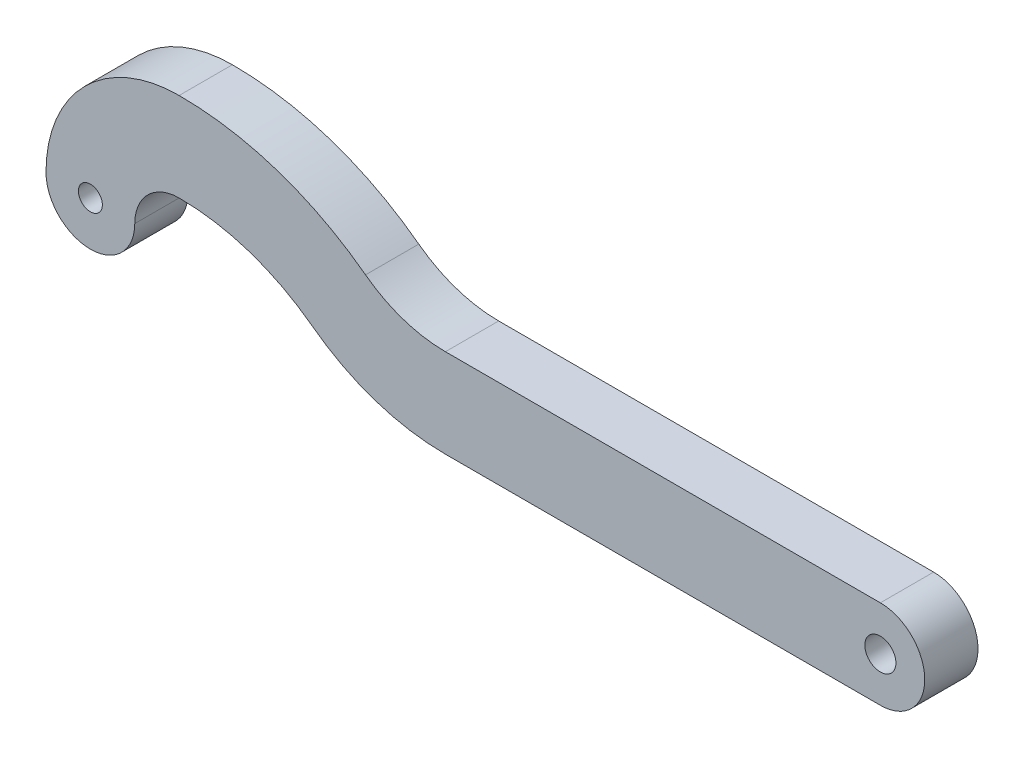
ISO-10303-21;
HEADER;
FILE_DESCRIPTION(('STEP AP214'),'2;1');
FILE_NAME('part.step','',(''),(''),'','','');
FILE_SCHEMA(('AUTOMOTIVE_DESIGN { 1 0 10303 214 1 1 1 1 }'));
ENDSEC;
DATA;
#1=APPLICATION_CONTEXT('core data for automotive mechanical design processes');
#2=APPLICATION_PROTOCOL_DEFINITION('international standard','automotive_design',2000,#1);
#3=PRODUCT_CONTEXT('',#1,'mechanical');
#4=PRODUCT('Part','Part','',(#3));
#5=PRODUCT_RELATED_PRODUCT_CATEGORY('part','',(#4));
#6=PRODUCT_DEFINITION_FORMATION('','',#4);
#7=PRODUCT_DEFINITION_CONTEXT('part definition',#1,'design');
#8=PRODUCT_DEFINITION('design','',#6,#7);
#9=PRODUCT_DEFINITION_SHAPE('','',#8);
#10=(LENGTH_UNIT() NAMED_UNIT(*) SI_UNIT(.MILLI.,.METRE.));
#11=(NAMED_UNIT(*) PLANE_ANGLE_UNIT() SI_UNIT($,.RADIAN.));
#12=(NAMED_UNIT(*) SI_UNIT($,.STERADIAN.) SOLID_ANGLE_UNIT());
#13=UNCERTAINTY_MEASURE_WITH_UNIT(LENGTH_MEASURE(1.E-05),#10,'distance_accuracy_value','');
#14=(GEOMETRIC_REPRESENTATION_CONTEXT(3) GLOBAL_UNCERTAINTY_ASSIGNED_CONTEXT((#13)) GLOBAL_UNIT_ASSIGNED_CONTEXT((#10,
#11,#12)) REPRESENTATION_CONTEXT('',''));
#15=CARTESIAN_POINT('',(0.,0.,0.));
#16=DIRECTION('',(0.,0.,1.));
#17=DIRECTION('',(1.,0.,0.));
#18=AXIS2_PLACEMENT_3D('',#15,#16,#17);
#19=CARTESIAN_POINT('',(0.,5.,6.));
#20=DIRECTION('',(0.,0.,1.));
#21=DIRECTION('',(1.,0.,0.));
#22=AXIS2_PLACEMENT_3D('',#19,#20,#21);
#23=PLANE('',#22);
#24=CARTESIAN_POINT('',(0.,5.,6.));
#25=DIRECTION('',(0.,0.,1.));
#26=DIRECTION('',(1.,0.,0.));
#27=AXIS2_PLACEMENT_3D('',#24,#25,#26);
#28=CIRCLE('',#27,1.35);
#29=CARTESIAN_POINT('',(1.35,5.,6.));
#30=VERTEX_POINT('',#29);
#31=EDGE_CURVE('E165',#30,#30,#28,.T.);
#32=ORIENTED_EDGE('',*,*,#31,.F.);
#33=EDGE_LOOP('',(#32));
#34=FACE_BOUND('',#33,.T.);
#35=CARTESIAN_POINT('',(0.,5.,6.));
#36=DIRECTION('',(0.,0.,1.));
#37=DIRECTION('',(1.,0.,0.));
#38=AXIS2_PLACEMENT_3D('',#35,#36,#37);
#39=CIRCLE('',#38,5.);
#40=CARTESIAN_POINT('',(-5.,5.,6.));
#41=VERTEX_POINT('',#40);
#42=CARTESIAN_POINT('',(5.,5.,6.));
#43=VERTEX_POINT('',#42);
#44=EDGE_CURVE('E60',#41,#43,#39,.T.);
#45=ORIENTED_EDGE('',*,*,#44,.T.);
#46=CARTESIAN_POINT('',(10.,5.,6.));
#47=DIRECTION('',(0.,0.,-1.));
#48=DIRECTION('',(-1.,0.,0.));
#49=AXIS2_PLACEMENT_3D('',#46,#47,#48);
#50=CIRCLE('',#49,5.);
#51=CARTESIAN_POINT('',(10.,10.,6.));
#52=VERTEX_POINT('',#51);
#53=EDGE_CURVE('E111',#43,#52,#50,.T.);
#54=ORIENTED_EDGE('',*,*,#53,.T.);
#55=CARTESIAN_POINT('',(10.,-15.,6.));
#56=DIRECTION('',(0.,0.,-1.));
#57=DIRECTION('',(-1.,0.,0.));
#58=AXIS2_PLACEMENT_3D('',#55,#56,#57);
#59=CIRCLE('',#58,25.);
#60=CARTESIAN_POINT('',(25.,5.,6.));
#61=VERTEX_POINT('',#60);
#62=EDGE_CURVE('E282',#52,#61,#59,.T.);
#63=ORIENTED_EDGE('',*,*,#62,.T.);
#64=CARTESIAN_POINT('',(40.,24.9999999999999,6.));
#65=DIRECTION('',(0.,0.,1.));
#66=DIRECTION('',(1.,0.,0.));
#67=AXIS2_PLACEMENT_3D('',#64,#65,#66);
#68=CIRCLE('',#67,24.9999999999999);
#69=CARTESIAN_POINT('',(40.,0.,6.));
#70=VERTEX_POINT('',#69);
#71=EDGE_CURVE('E295',#61,#70,#68,.T.);
#72=ORIENTED_EDGE('',*,*,#71,.T.);
#73=DIRECTION('',(1.,0.,0.));
#74=VECTOR('',#73,1.);
#75=CARTESIAN_POINT('',(40.,0.,6.));
#76=LINE('',#75,#74);
#77=CARTESIAN_POINT('',(89.,0.,6.));
#78=VERTEX_POINT('',#77);
#79=EDGE_CURVE('E291',#70,#78,#76,.T.);
#80=ORIENTED_EDGE('',*,*,#79,.T.);
#81=CARTESIAN_POINT('',(89.,5.,6.));
#82=DIRECTION('',(0.,0.,1.));
#83=DIRECTION('',(-1.,0.,0.));
#84=AXIS2_PLACEMENT_3D('',#81,#82,#83);
#85=CIRCLE('',#84,5.);
#86=CARTESIAN_POINT('',(89.,10.,6.));
#87=VERTEX_POINT('',#86);
#88=EDGE_CURVE('E294',#78,#87,#85,.T.);
#89=ORIENTED_EDGE('',*,*,#88,.T.);
#90=DIRECTION('',(-1.,0.,0.));
#91=VECTOR('',#90,1.);
#92=CARTESIAN_POINT('',(40.,10.,6.));
#93=LINE('',#92,#91);
#94=CARTESIAN_POINT('',(40.,10.,6.));
#95=VERTEX_POINT('',#94);
#96=EDGE_CURVE('E137',#87,#95,#93,.T.);
#97=ORIENTED_EDGE('',*,*,#96,.T.);
#98=CARTESIAN_POINT('',(40.,24.9999999999999,6.));
#99=DIRECTION('',(0.,0.,-1.));
#100=DIRECTION('',(1.,0.,0.));
#101=AXIS2_PLACEMENT_3D('',#98,#99,#100);
#102=CIRCLE('',#101,14.9999999999999);
#103=CARTESIAN_POINT('',(31.,13.,6.));
#104=VERTEX_POINT('',#103);
#105=EDGE_CURVE('E131',#95,#104,#102,.T.);
#106=ORIENTED_EDGE('',*,*,#105,.T.);
#107=CARTESIAN_POINT('',(9.99999999999999,-15.,6.));
#108=DIRECTION('',(0.,0.,1.));
#109=DIRECTION('',(-1.,0.,0.));
#110=AXIS2_PLACEMENT_3D('',#107,#108,#109);
#111=CIRCLE('',#110,35.);
#112=CARTESIAN_POINT('',(10.,20.,6.));
#113=VERTEX_POINT('',#112);
#114=EDGE_CURVE('E135',#104,#113,#111,.T.);
#115=ORIENTED_EDGE('',*,*,#114,.T.);
#116=CARTESIAN_POINT('',(10.,5.,6.));
#117=DIRECTION('',(0.,0.,1.));
#118=DIRECTION('',(-1.,0.,0.));
#119=AXIS2_PLACEMENT_3D('',#116,#117,#118);
#120=CIRCLE('',#119,15.);
#121=EDGE_CURVE('E154',#113,#41,#120,.T.);
#122=ORIENTED_EDGE('',*,*,#121,.T.);
#123=EDGE_LOOP('',(#45,#54,#63,#72,#80,#89,#97,#106,#115,#122));
#124=FACE_BOUND('',#123,.T.);
#125=CARTESIAN_POINT('',(89.,5.,6.));
#126=DIRECTION('',(0.,0.,1.));
#127=DIRECTION('',(1.,0.,0.));
#128=AXIS2_PLACEMENT_3D('',#125,#126,#127);
#129=CIRCLE('',#128,1.75);
#130=CARTESIAN_POINT('',(90.75,5.,6.));
#131=VERTEX_POINT('',#130);
#132=EDGE_CURVE('E313',#131,#131,#129,.T.);
#133=ORIENTED_EDGE('',*,*,#132,.F.);
#134=EDGE_LOOP('',(#133));
#135=FACE_BOUND('',#134,.T.);
#136=ADVANCED_FACE('F41',(#34,#124,#135),#23,.T.);
#137=CARTESIAN_POINT('',(0.,5.,0.));
#138=DIRECTION('',(0.,0.,1.));
#139=DIRECTION('',(1.,0.,0.));
#140=AXIS2_PLACEMENT_3D('',#137,#138,#139);
#141=PLANE('',#140);
#142=CARTESIAN_POINT('',(89.,5.,0.));
#143=DIRECTION('',(0.,0.,1.));
#144=DIRECTION('',(1.,0.,0.));
#145=AXIS2_PLACEMENT_3D('',#142,#143,#144);
#146=CIRCLE('',#145,3.00000000000003);
#147=CARTESIAN_POINT('',(92.,5.,0.));
#148=VERTEX_POINT('',#147);
#149=EDGE_CURVE('E52',#148,#148,#146,.T.);
#150=ORIENTED_EDGE('',*,*,#149,.T.);
#151=EDGE_LOOP('',(#150));
#152=FACE_BOUND('',#151,.T.);
#153=CARTESIAN_POINT('',(10.,5.,0.));
#154=DIRECTION('',(0.,0.,-1.));
#155=DIRECTION('',(-1.,0.,0.));
#156=AXIS2_PLACEMENT_3D('',#153,#154,#155);
#157=CIRCLE('',#156,5.);
#158=CARTESIAN_POINT('',(5.,5.,0.));
#159=VERTEX_POINT('',#158);
#160=CARTESIAN_POINT('',(10.,10.,0.));
#161=VERTEX_POINT('',#160);
#162=EDGE_CURVE('E161',#159,#161,#157,.T.);
#163=ORIENTED_EDGE('',*,*,#162,.F.);
#164=CARTESIAN_POINT('',(0.,5.,0.));
#165=DIRECTION('',(0.,0.,1.));
#166=DIRECTION('',(1.,0.,0.));
#167=AXIS2_PLACEMENT_3D('',#164,#165,#166);
#168=CIRCLE('',#167,5.);
#169=CARTESIAN_POINT('',(-5.,5.,0.));
#170=VERTEX_POINT('',#169);
#171=EDGE_CURVE('E186',#170,#159,#168,.T.);
#172=ORIENTED_EDGE('',*,*,#171,.F.);
#173=CARTESIAN_POINT('',(10.,5.,0.));
#174=DIRECTION('',(0.,0.,1.));
#175=DIRECTION('',(-1.,0.,0.));
#176=AXIS2_PLACEMENT_3D('',#173,#174,#175);
#177=CIRCLE('',#176,15.);
#178=CARTESIAN_POINT('',(10.,20.,0.));
#179=VERTEX_POINT('',#178);
#180=EDGE_CURVE('E103',#179,#170,#177,.T.);
#181=ORIENTED_EDGE('',*,*,#180,.F.);
#182=CARTESIAN_POINT('',(9.99999999999999,-15.,0.));
#183=DIRECTION('',(0.,0.,1.));
#184=DIRECTION('',(-1.,0.,0.));
#185=AXIS2_PLACEMENT_3D('',#182,#183,#184);
#186=CIRCLE('',#185,35.);
#187=CARTESIAN_POINT('',(31.,13.,0.));
#188=VERTEX_POINT('',#187);
#189=EDGE_CURVE('E96',#188,#179,#186,.T.);
#190=ORIENTED_EDGE('',*,*,#189,.F.);
#191=CARTESIAN_POINT('',(40.,24.9999999999999,0.));
#192=DIRECTION('',(0.,0.,-1.));
#193=DIRECTION('',(1.,0.,0.));
#194=AXIS2_PLACEMENT_3D('',#191,#192,#193);
#195=CIRCLE('',#194,14.9999999999999);
#196=CARTESIAN_POINT('',(40.,10.,0.));
#197=VERTEX_POINT('',#196);
#198=EDGE_CURVE('E146',#197,#188,#195,.T.);
#199=ORIENTED_EDGE('',*,*,#198,.F.);
#200=DIRECTION('',(-1.,0.,0.));
#201=VECTOR('',#200,1.);
#202=CARTESIAN_POINT('',(40.,10.,0.));
#203=LINE('',#202,#201);
#204=CARTESIAN_POINT('',(89.,10.,0.));
#205=VERTEX_POINT('',#204);
#206=EDGE_CURVE('E177',#205,#197,#203,.T.);
#207=ORIENTED_EDGE('',*,*,#206,.F.);
#208=CARTESIAN_POINT('',(89.,5.,0.));
#209=DIRECTION('',(0.,0.,1.));
#210=DIRECTION('',(-1.,0.,0.));
#211=AXIS2_PLACEMENT_3D('',#208,#209,#210);
#212=CIRCLE('',#211,5.);
#213=CARTESIAN_POINT('',(89.,0.,0.));
#214=VERTEX_POINT('',#213);
#215=EDGE_CURVE('E174',#214,#205,#212,.T.);
#216=ORIENTED_EDGE('',*,*,#215,.F.);
#217=DIRECTION('',(1.,0.,0.));
#218=VECTOR('',#217,1.);
#219=CARTESIAN_POINT('',(40.,0.,0.));
#220=LINE('',#219,#218);
#221=CARTESIAN_POINT('',(40.,0.,0.));
#222=VERTEX_POINT('',#221);
#223=EDGE_CURVE('E171',#222,#214,#220,.T.);
#224=ORIENTED_EDGE('',*,*,#223,.F.);
#225=CARTESIAN_POINT('',(40.,24.9999999999999,0.));
#226=DIRECTION('',(0.,0.,1.));
#227=DIRECTION('',(1.,0.,0.));
#228=AXIS2_PLACEMENT_3D('',#225,#226,#227);
#229=CIRCLE('',#228,24.9999999999999);
#230=CARTESIAN_POINT('',(25.,5.,0.));
#231=VERTEX_POINT('',#230);
#232=EDGE_CURVE('E168',#231,#222,#229,.T.);
#233=ORIENTED_EDGE('',*,*,#232,.F.);
#234=CARTESIAN_POINT('',(10.,-15.,0.));
#235=DIRECTION('',(0.,0.,-1.));
#236=DIRECTION('',(-1.,0.,0.));
#237=AXIS2_PLACEMENT_3D('',#234,#235,#236);
#238=CIRCLE('',#237,25.);
#239=EDGE_CURVE('E164',#161,#231,#238,.T.);
#240=ORIENTED_EDGE('',*,*,#239,.F.);
#241=EDGE_LOOP('',(#163,#172,#181,#190,#199,#207,#216,#224,#233,#240));
#242=FACE_BOUND('',#241,.T.);
#243=CARTESIAN_POINT('',(0.,5.,0.));
#244=DIRECTION('',(0.,0.,1.));
#245=DIRECTION('',(1.,0.,0.));
#246=AXIS2_PLACEMENT_3D('',#243,#244,#245);
#247=CIRCLE('',#246,1.35);
#248=CARTESIAN_POINT('',(1.35,5.,0.));
#249=VERTEX_POINT('',#248);
#250=EDGE_CURVE('E309',#249,#249,#247,.T.);
#251=ORIENTED_EDGE('',*,*,#250,.T.);
#252=EDGE_LOOP('',(#251));
#253=FACE_BOUND('',#252,.T.);
#254=ADVANCED_FACE('F221',(#152,#242,#253),#141,.F.);
#255=CARTESIAN_POINT('',(10.,5.,6.));
#256=DIRECTION('',(0.,0.,-1.));
#257=DIRECTION('',(-1.,0.,0.));
#258=AXIS2_PLACEMENT_3D('',#255,#256,#257);
#259=CYLINDRICAL_SURFACE('',#258,5.);
#260=ORIENTED_EDGE('',*,*,#162,.T.);
#261=DIRECTION('',(0.,0.,-1.));
#262=VECTOR('',#261,1.);
#263=CARTESIAN_POINT('',(10.,10.,6.));
#264=LINE('',#263,#262);
#265=EDGE_CURVE('E211',#52,#161,#264,.T.);
#266=ORIENTED_EDGE('',*,*,#265,.F.);
#267=ORIENTED_EDGE('',*,*,#53,.F.);
#268=DIRECTION('',(0.,0.,-1.));
#269=VECTOR('',#268,1.);
#270=CARTESIAN_POINT('',(5.,5.,6.));
#271=LINE('',#270,#269);
#272=EDGE_CURVE('E215',#43,#159,#271,.T.);
#273=ORIENTED_EDGE('',*,*,#272,.T.);
#274=EDGE_LOOP('',(#260,#266,#267,#273));
#275=FACE_BOUND('',#274,.T.);
#276=ADVANCED_FACE('F240',(#275),#259,.F.);
#277=CARTESIAN_POINT('',(10.,-15.,6.));
#278=DIRECTION('',(0.,0.,-1.));
#279=DIRECTION('',(-1.,0.,0.));
#280=AXIS2_PLACEMENT_3D('',#277,#278,#279);
#281=CYLINDRICAL_SURFACE('',#280,25.);
#282=ORIENTED_EDGE('',*,*,#239,.T.);
#283=DIRECTION('',(0.,0.,-1.));
#284=VECTOR('',#283,1.);
#285=CARTESIAN_POINT('',(25.,5.,6.));
#286=LINE('',#285,#284);
#287=EDGE_CURVE('E207',#61,#231,#286,.T.);
#288=ORIENTED_EDGE('',*,*,#287,.F.);
#289=ORIENTED_EDGE('',*,*,#62,.F.);
#290=ORIENTED_EDGE('',*,*,#265,.T.);
#291=EDGE_LOOP('',(#282,#288,#289,#290));
#292=FACE_BOUND('',#291,.T.);
#293=ADVANCED_FACE('F270',(#292),#281,.F.);
#294=CARTESIAN_POINT('',(40.,24.9999999999999,6.));
#295=DIRECTION('',(0.,0.,-1.));
#296=DIRECTION('',(-1.,0.,0.));
#297=AXIS2_PLACEMENT_3D('',#294,#295,#296);
#298=CYLINDRICAL_SURFACE('',#297,24.9999999999999);
#299=ORIENTED_EDGE('',*,*,#232,.T.);
#300=DIRECTION('',(0.,0.,-1.));
#301=VECTOR('',#300,1.);
#302=CARTESIAN_POINT('',(40.,0.,6.));
#303=LINE('',#302,#301);
#304=EDGE_CURVE('E203',#70,#222,#303,.T.);
#305=ORIENTED_EDGE('',*,*,#304,.F.);
#306=ORIENTED_EDGE('',*,*,#71,.F.);
#307=ORIENTED_EDGE('',*,*,#287,.T.);
#308=EDGE_LOOP('',(#299,#305,#306,#307));
#309=FACE_BOUND('',#308,.T.);
#310=ADVANCED_FACE('F266',(#309),#298,.T.);
#311=CARTESIAN_POINT('',(40.,0.,6.));
#312=DIRECTION('',(0.,1.,0.));
#313=DIRECTION('',(-1.,0.,0.));
#314=AXIS2_PLACEMENT_3D('',#311,#312,#313);
#315=PLANE('',#314);
#316=ORIENTED_EDGE('',*,*,#223,.T.);
#317=DIRECTION('',(0.,0.,-1.));
#318=VECTOR('',#317,1.);
#319=CARTESIAN_POINT('',(89.,0.,6.));
#320=LINE('',#319,#318);
#321=EDGE_CURVE('E199',#78,#214,#320,.T.);
#322=ORIENTED_EDGE('',*,*,#321,.F.);
#323=ORIENTED_EDGE('',*,*,#79,.F.);
#324=ORIENTED_EDGE('',*,*,#304,.T.);
#325=EDGE_LOOP('',(#316,#322,#323,#324));
#326=FACE_BOUND('',#325,.T.);
#327=ADVANCED_FACE('F262',(#326),#315,.F.);
#328=CARTESIAN_POINT('',(89.,5.,6.));
#329=DIRECTION('',(0.,0.,-1.));
#330=DIRECTION('',(-1.,0.,0.));
#331=AXIS2_PLACEMENT_3D('',#328,#329,#330);
#332=CYLINDRICAL_SURFACE('',#331,5.);
#333=ORIENTED_EDGE('',*,*,#215,.T.);
#334=DIRECTION('',(0.,0.,-1.));
#335=VECTOR('',#334,1.);
#336=CARTESIAN_POINT('',(89.,10.,6.));
#337=LINE('',#336,#335);
#338=EDGE_CURVE('E195',#87,#205,#337,.T.);
#339=ORIENTED_EDGE('',*,*,#338,.F.);
#340=ORIENTED_EDGE('',*,*,#88,.F.);
#341=ORIENTED_EDGE('',*,*,#321,.T.);
#342=EDGE_LOOP('',(#333,#339,#340,#341));
#343=FACE_BOUND('',#342,.T.);
#344=ADVANCED_FACE('F258',(#343),#332,.T.);
#345=CARTESIAN_POINT('',(40.,10.,6.));
#346=DIRECTION('',(0.,-1.,0.));
#347=DIRECTION('',(1.,0.,0.));
#348=AXIS2_PLACEMENT_3D('',#345,#346,#347);
#349=PLANE('',#348);
#350=ORIENTED_EDGE('',*,*,#206,.T.);
#351=DIRECTION('',(0.,0.,-1.));
#352=VECTOR('',#351,1.);
#353=CARTESIAN_POINT('',(40.,10.,6.));
#354=LINE('',#353,#352);
#355=EDGE_CURVE('E148',#95,#197,#354,.T.);
#356=ORIENTED_EDGE('',*,*,#355,.F.);
#357=ORIENTED_EDGE('',*,*,#96,.F.);
#358=ORIENTED_EDGE('',*,*,#338,.T.);
#359=EDGE_LOOP('',(#350,#356,#357,#358));
#360=FACE_BOUND('',#359,.T.);
#361=ADVANCED_FACE('F255',(#360),#349,.F.);
#362=CARTESIAN_POINT('',(40.,24.9999999999999,6.));
#363=DIRECTION('',(0.,0.,-1.));
#364=DIRECTION('',(-1.,0.,0.));
#365=AXIS2_PLACEMENT_3D('',#362,#363,#364);
#366=CYLINDRICAL_SURFACE('',#365,14.9999999999999);
#367=ORIENTED_EDGE('',*,*,#198,.T.);
#368=DIRECTION('',(0.,0.,-1.));
#369=VECTOR('',#368,1.);
#370=CARTESIAN_POINT('',(31.,13.,6.));
#371=LINE('',#370,#369);
#372=EDGE_CURVE('E143',#104,#188,#371,.T.);
#373=ORIENTED_EDGE('',*,*,#372,.F.);
#374=ORIENTED_EDGE('',*,*,#105,.F.);
#375=ORIENTED_EDGE('',*,*,#355,.T.);
#376=EDGE_LOOP('',(#367,#373,#374,#375));
#377=FACE_BOUND('',#376,.T.);
#378=ADVANCED_FACE('F144',(#377),#366,.F.);
#379=CARTESIAN_POINT('',(9.99999999999999,-15.,6.));
#380=DIRECTION('',(0.,0.,-1.));
#381=DIRECTION('',(-1.,0.,0.));
#382=AXIS2_PLACEMENT_3D('',#379,#380,#381);
#383=CYLINDRICAL_SURFACE('',#382,35.);
#384=ORIENTED_EDGE('',*,*,#189,.T.);
#385=DIRECTION('',(0.,0.,-1.));
#386=VECTOR('',#385,1.);
#387=CARTESIAN_POINT('',(10.,20.,6.));
#388=LINE('',#387,#386);
#389=EDGE_CURVE('E149',#113,#179,#388,.T.);
#390=ORIENTED_EDGE('',*,*,#389,.F.);
#391=ORIENTED_EDGE('',*,*,#114,.F.);
#392=ORIENTED_EDGE('',*,*,#372,.T.);
#393=EDGE_LOOP('',(#384,#390,#391,#392));
#394=FACE_BOUND('',#393,.T.);
#395=ADVANCED_FACE('F151',(#394),#383,.T.);
#396=CARTESIAN_POINT('',(10.,5.,6.));
#397=DIRECTION('',(0.,0.,-1.));
#398=DIRECTION('',(-1.,0.,0.));
#399=AXIS2_PLACEMENT_3D('',#396,#397,#398);
#400=CYLINDRICAL_SURFACE('',#399,15.);
#401=ORIENTED_EDGE('',*,*,#180,.T.);
#402=DIRECTION('',(0.,0.,-1.));
#403=VECTOR('',#402,1.);
#404=CARTESIAN_POINT('',(-5.,5.,6.));
#405=LINE('',#404,#403);
#406=EDGE_CURVE('E157',#41,#170,#405,.T.);
#407=ORIENTED_EDGE('',*,*,#406,.F.);
#408=ORIENTED_EDGE('',*,*,#121,.F.);
#409=ORIENTED_EDGE('',*,*,#389,.T.);
#410=EDGE_LOOP('',(#401,#407,#408,#409));
#411=FACE_BOUND('',#410,.T.);
#412=ADVANCED_FACE('F248',(#411),#400,.T.);
#413=CARTESIAN_POINT('',(0.,5.,6.));
#414=DIRECTION('',(0.,0.,-1.));
#415=DIRECTION('',(-1.,0.,0.));
#416=AXIS2_PLACEMENT_3D('',#413,#414,#415);
#417=CYLINDRICAL_SURFACE('',#416,5.);
#418=ORIENTED_EDGE('',*,*,#171,.T.);
#419=ORIENTED_EDGE('',*,*,#272,.F.);
#420=ORIENTED_EDGE('',*,*,#44,.F.);
#421=ORIENTED_EDGE('',*,*,#406,.T.);
#422=EDGE_LOOP('',(#418,#419,#420,#421));
#423=FACE_BOUND('',#422,.T.);
#424=ADVANCED_FACE('F245',(#423),#417,.T.);
#425=CARTESIAN_POINT('',(0.,5.,6.));
#426=DIRECTION('',(0.,0.,-1.));
#427=DIRECTION('',(-1.,0.,0.));
#428=AXIS2_PLACEMENT_3D('',#425,#426,#427);
#429=CYLINDRICAL_SURFACE('',#428,1.35);
#430=ORIENTED_EDGE('',*,*,#31,.T.);
#431=EDGE_LOOP('',(#430));
#432=FACE_BOUND('',#431,.T.);
#433=ORIENTED_EDGE('',*,*,#250,.F.);
#434=EDGE_LOOP('',(#433));
#435=FACE_BOUND('',#434,.T.);
#436=ADVANCED_FACE('F230',(#432,#435),#429,.F.);
#437=CARTESIAN_POINT('',(89.,5.,6.));
#438=DIRECTION('',(0.,0.,-1.));
#439=DIRECTION('',(-1.,0.,0.));
#440=AXIS2_PLACEMENT_3D('',#437,#438,#439);
#441=CYLINDRICAL_SURFACE('',#440,1.75);
#442=CARTESIAN_POINT('',(89.,5.,1.25000000000003));
#443=DIRECTION('',(0.,0.,1.));
#444=DIRECTION('',(1.,0.,0.));
#445=AXIS2_PLACEMENT_3D('',#442,#443,#444);
#446=CIRCLE('',#445,1.75);
#447=CARTESIAN_POINT('',(90.75,5.,1.25000000000003));
#448=VERTEX_POINT('',#447);
#449=EDGE_CURVE('E11',#448,#448,#446,.F.);
#450=ORIENTED_EDGE('',*,*,#449,.T.);
#451=EDGE_LOOP('',(#450));
#452=FACE_BOUND('',#451,.T.);
#453=ORIENTED_EDGE('',*,*,#132,.T.);
#454=EDGE_LOOP('',(#453));
#455=FACE_BOUND('',#454,.T.);
#456=ADVANCED_FACE('F225',(#452,#455),#441,.F.);
#457=CARTESIAN_POINT('',(89.,5.,0.));
#458=DIRECTION('',(0.,0.,-1.));
#459=DIRECTION('',(-1.,0.,0.));
#460=AXIS2_PLACEMENT_3D('',#457,#458,#459);
#461=CONICAL_SURFACE('',#460,3.00000000000003,0.785398163397451);
#462=ORIENTED_EDGE('',*,*,#449,.F.);
#463=EDGE_LOOP('',(#462));
#464=FACE_BOUND('',#463,.T.);
#465=ORIENTED_EDGE('',*,*,#149,.F.);
#466=EDGE_LOOP('',(#465));
#467=FACE_BOUND('',#466,.T.);
#468=ADVANCED_FACE('F44',(#464,#467),#461,.F.);
#469=CLOSED_SHELL('',(#136,#254,#276,#293,#310,#327,#344,#361,#378,#395,#412,#424,#436,#456,#468));
#470=MANIFOLD_SOLID_BREP('B2',#469);
#471=ADVANCED_BREP_SHAPE_REPRESENTATION('',(#18,#470),#14);
#472=SHAPE_DEFINITION_REPRESENTATION(#9,#471);
ENDSEC;
END-ISO-10303-21;
